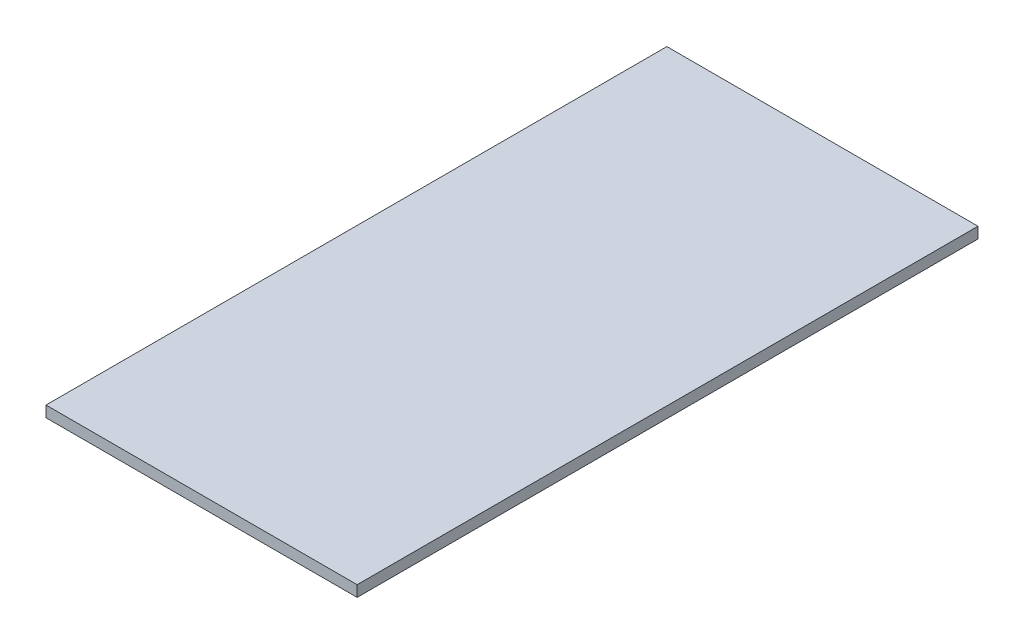
ISO-10303-21;
HEADER;
FILE_DESCRIPTION(('STEP AP214'),'2;1');
FILE_NAME('part.step','',(''),(''),'','','');
FILE_SCHEMA(('AUTOMOTIVE_DESIGN { 1 0 10303 214 1 1 1 1 }'));
ENDSEC;
DATA;
#1=APPLICATION_CONTEXT('core data for automotive mechanical design processes');
#2=APPLICATION_PROTOCOL_DEFINITION('international standard','automotive_design',2000,#1);
#3=PRODUCT_CONTEXT('',#1,'mechanical');
#4=PRODUCT('Part','Part','',(#3));
#5=PRODUCT_RELATED_PRODUCT_CATEGORY('part','',(#4));
#6=PRODUCT_DEFINITION_FORMATION('','',#4);
#7=PRODUCT_DEFINITION_CONTEXT('part definition',#1,'design');
#8=PRODUCT_DEFINITION('design','',#6,#7);
#9=PRODUCT_DEFINITION_SHAPE('','',#8);
#10=(LENGTH_UNIT() NAMED_UNIT(*) SI_UNIT(.MILLI.,.METRE.));
#11=(NAMED_UNIT(*) PLANE_ANGLE_UNIT() SI_UNIT($,.RADIAN.));
#12=(NAMED_UNIT(*) SI_UNIT($,.STERADIAN.) SOLID_ANGLE_UNIT());
#13=UNCERTAINTY_MEASURE_WITH_UNIT(LENGTH_MEASURE(1.E-05),#10,'distance_accuracy_value','');
#14=(GEOMETRIC_REPRESENTATION_CONTEXT(3) GLOBAL_UNCERTAINTY_ASSIGNED_CONTEXT((#13)) GLOBAL_UNIT_ASSIGNED_CONTEXT((#10,
#11,#12)) REPRESENTATION_CONTEXT('',''));
#15=CARTESIAN_POINT('',(0.,0.,0.));
#16=DIRECTION('',(0.,0.,1.));
#17=DIRECTION('',(1.,0.,0.));
#18=AXIS2_PLACEMENT_3D('',#15,#16,#17);
#19=CARTESIAN_POINT('',(80.652963278762,228.707138557304,40.0000000000001));
#20=DIRECTION('',(-1.,0.,0.));
#21=DIRECTION('',(0.,0.,1.));
#22=AXIS2_PLACEMENT_3D('',#19,#20,#21);
#23=PLANE('',#22);
#24=DIRECTION('',(0.,0.,-1.));
#25=VECTOR('',#24,1.);
#26=CARTESIAN_POINT('',(80.652963278762,220.707138557304,40.0000000000001));
#27=LINE('',#26,#25);
#28=CARTESIAN_POINT('',(80.652963278762,220.707138557304,490.));
#29=VERTEX_POINT('',#28);
#30=CARTESIAN_POINT('',(80.652963278762,220.707138557304,40.0000000000001));
#31=VERTEX_POINT('',#30);
#32=EDGE_CURVE('E104',#29,#31,#27,.T.);
#33=ORIENTED_EDGE('',*,*,#32,.T.);
#34=DIRECTION('',(0.,-1.,0.));
#35=VECTOR('',#34,1.);
#36=CARTESIAN_POINT('',(80.652963278762,228.707138557304,40.0000000000001));
#37=LINE('',#36,#35);
#38=CARTESIAN_POINT('',(80.652963278762,228.707138557304,40.0000000000001));
#39=VERTEX_POINT('',#38);
#40=EDGE_CURVE('E11',#39,#31,#37,.T.);
#41=ORIENTED_EDGE('',*,*,#40,.F.);
#42=DIRECTION('',(0.,0.,-1.));
#43=VECTOR('',#42,1.);
#44=CARTESIAN_POINT('',(80.652963278762,228.707138557304,40.0000000000001));
#45=LINE('',#44,#43);
#46=CARTESIAN_POINT('',(80.652963278762,228.707138557304,490.));
#47=VERTEX_POINT('',#46);
#48=EDGE_CURVE('E92',#47,#39,#45,.T.);
#49=ORIENTED_EDGE('',*,*,#48,.F.);
#50=DIRECTION('',(0.,-1.,0.));
#51=VECTOR('',#50,1.);
#52=CARTESIAN_POINT('',(80.652963278762,228.707138557304,490.));
#53=LINE('',#52,#51);
#54=EDGE_CURVE('E100',#47,#29,#53,.T.);
#55=ORIENTED_EDGE('',*,*,#54,.T.);
#56=EDGE_LOOP('',(#33,#41,#49,#55));
#57=FACE_BOUND('',#56,.T.);
#58=ADVANCED_FACE('F41',(#57),#23,.F.);
#59=CARTESIAN_POINT('',(-144.857036721238,228.707138557304,39.9999999999997));
#60=DIRECTION('',(0.,0.,1.));
#61=DIRECTION('',(1.,0.,0.));
#62=AXIS2_PLACEMENT_3D('',#59,#60,#61);
#63=PLANE('',#62);
#64=DIRECTION('',(-1.,0.,0.));
#65=VECTOR('',#64,1.);
#66=CARTESIAN_POINT('',(-144.857036721238,220.707138557304,39.9999999999997));
#67=LINE('',#66,#65);
#68=CARTESIAN_POINT('',(-144.857036721238,220.707138557304,39.9999999999997));
#69=VERTEX_POINT('',#68);
#70=EDGE_CURVE('E96',#31,#69,#67,.T.);
#71=ORIENTED_EDGE('',*,*,#70,.T.);
#72=DIRECTION('',(0.,-1.,0.));
#73=VECTOR('',#72,1.);
#74=CARTESIAN_POINT('',(-144.857036721238,228.707138557304,39.9999999999997));
#75=LINE('',#74,#73);
#76=CARTESIAN_POINT('',(-144.857036721238,228.707138557304,39.9999999999997));
#77=VERTEX_POINT('',#76);
#78=EDGE_CURVE('E49',#77,#69,#75,.T.);
#79=ORIENTED_EDGE('',*,*,#78,.F.);
#80=DIRECTION('',(-1.,0.,0.));
#81=VECTOR('',#80,1.);
#82=CARTESIAN_POINT('',(-144.857036721238,228.707138557304,39.9999999999997));
#83=LINE('',#82,#81);
#84=EDGE_CURVE('E87',#39,#77,#83,.T.);
#85=ORIENTED_EDGE('',*,*,#84,.F.);
#86=ORIENTED_EDGE('',*,*,#40,.T.);
#87=EDGE_LOOP('',(#71,#79,#85,#86));
#88=FACE_BOUND('',#87,.T.);
#89=ADVANCED_FACE('F95',(#88),#63,.F.);
#90=CARTESIAN_POINT('',(-144.857036721238,228.707138557304,39.9999999999997));
#91=DIRECTION('',(1.,0.,0.));
#92=DIRECTION('',(0.,0.,-1.));
#93=AXIS2_PLACEMENT_3D('',#90,#91,#92);
#94=PLANE('',#93);
#95=DIRECTION('',(0.,0.,1.));
#96=VECTOR('',#95,1.);
#97=CARTESIAN_POINT('',(-144.857036721238,220.707138557304,39.9999999999997));
#98=LINE('',#97,#96);
#99=CARTESIAN_POINT('',(-144.857036721238,220.707138557304,490.));
#100=VERTEX_POINT('',#99);
#101=EDGE_CURVE('E74',#69,#100,#98,.T.);
#102=ORIENTED_EDGE('',*,*,#101,.T.);
#103=DIRECTION('',(0.,-1.,0.));
#104=VECTOR('',#103,1.);
#105=CARTESIAN_POINT('',(-144.857036721238,228.707138557304,490.));
#106=LINE('',#105,#104);
#107=CARTESIAN_POINT('',(-144.857036721238,228.707138557304,490.));
#108=VERTEX_POINT('',#107);
#109=EDGE_CURVE('E97',#108,#100,#106,.T.);
#110=ORIENTED_EDGE('',*,*,#109,.F.);
#111=DIRECTION('',(0.,0.,1.));
#112=VECTOR('',#111,1.);
#113=CARTESIAN_POINT('',(-144.857036721238,228.707138557304,39.9999999999997));
#114=LINE('',#113,#112);
#115=EDGE_CURVE('E90',#77,#108,#114,.T.);
#116=ORIENTED_EDGE('',*,*,#115,.F.);
#117=ORIENTED_EDGE('',*,*,#78,.T.);
#118=EDGE_LOOP('',(#102,#110,#116,#117));
#119=FACE_BOUND('',#118,.T.);
#120=ADVANCED_FACE('F98',(#119),#94,.F.);
#121=CARTESIAN_POINT('',(-144.857036721238,228.707138557304,490.));
#122=DIRECTION('',(0.,0.,-1.));
#123=DIRECTION('',(-1.,0.,0.));
#124=AXIS2_PLACEMENT_3D('',#121,#122,#123);
#125=PLANE('',#124);
#126=DIRECTION('',(1.,0.,0.));
#127=VECTOR('',#126,1.);
#128=CARTESIAN_POINT('',(-144.857036721238,220.707138557304,490.));
#129=LINE('',#128,#127);
#130=EDGE_CURVE('E80',#100,#29,#129,.T.);
#131=ORIENTED_EDGE('',*,*,#130,.T.);
#132=ORIENTED_EDGE('',*,*,#54,.F.);
#133=DIRECTION('',(1.,0.,0.));
#134=VECTOR('',#133,1.);
#135=CARTESIAN_POINT('',(-144.857036721238,228.707138557304,490.));
#136=LINE('',#135,#134);
#137=EDGE_CURVE('E57',#108,#47,#136,.T.);
#138=ORIENTED_EDGE('',*,*,#137,.F.);
#139=ORIENTED_EDGE('',*,*,#109,.T.);
#140=EDGE_LOOP('',(#131,#132,#138,#139));
#141=FACE_BOUND('',#140,.T.);
#142=ADVANCED_FACE('F111',(#141),#125,.F.);
#143=CARTESIAN_POINT('',(0.,228.707138557304,0.));
#144=DIRECTION('',(0.,1.,0.));
#145=DIRECTION('',(0.,0.,1.));
#146=AXIS2_PLACEMENT_3D('',#143,#144,#145);
#147=PLANE('',#146);
#148=ORIENTED_EDGE('',*,*,#48,.T.);
#149=ORIENTED_EDGE('',*,*,#84,.T.);
#150=ORIENTED_EDGE('',*,*,#115,.T.);
#151=ORIENTED_EDGE('',*,*,#137,.T.);
#152=EDGE_LOOP('',(#148,#149,#150,#151));
#153=FACE_BOUND('',#152,.T.);
#154=ADVANCED_FACE('F88',(#153),#147,.T.);
#155=CARTESIAN_POINT('',(0.,220.707138557304,0.));
#156=DIRECTION('',(0.,1.,0.));
#157=DIRECTION('',(0.,0.,1.));
#158=AXIS2_PLACEMENT_3D('',#155,#156,#157);
#159=PLANE('',#158);
#160=ORIENTED_EDGE('',*,*,#32,.F.);
#161=ORIENTED_EDGE('',*,*,#130,.F.);
#162=ORIENTED_EDGE('',*,*,#101,.F.);
#163=ORIENTED_EDGE('',*,*,#70,.F.);
#164=EDGE_LOOP('',(#160,#161,#162,#163));
#165=FACE_BOUND('',#164,.T.);
#166=ADVANCED_FACE('F114',(#165),#159,.F.);
#167=CLOSED_SHELL('',(#58,#89,#120,#142,#154,#166));
#168=MANIFOLD_SOLID_BREP('B2',#167);
#169=ADVANCED_BREP_SHAPE_REPRESENTATION('',(#18,#168),#14);
#170=SHAPE_DEFINITION_REPRESENTATION(#9,#169);
ENDSEC;
END-ISO-10303-21;
